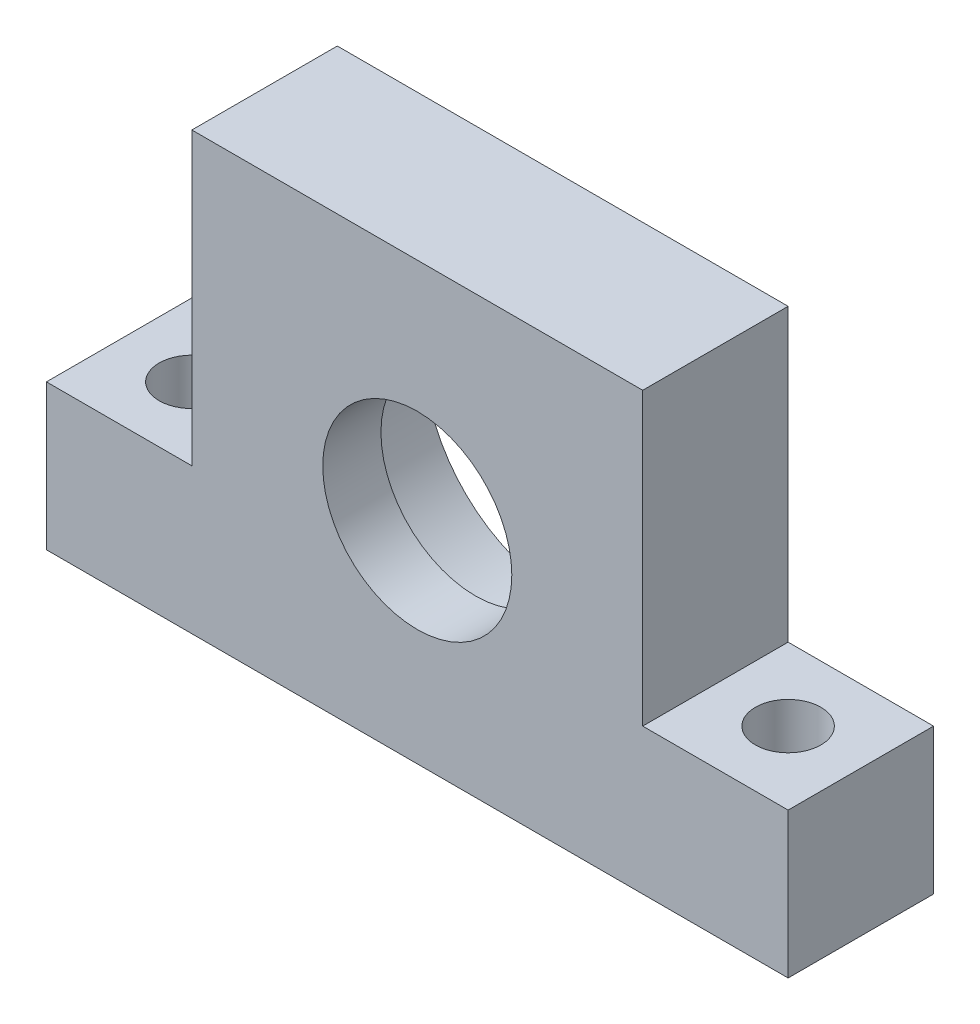
ISO-10303-21;
HEADER;
FILE_DESCRIPTION(('STEP AP214'),'2;1');
FILE_NAME('part.step','',(''),(''),'','','');
FILE_SCHEMA(('AUTOMOTIVE_DESIGN { 1 0 10303 214 1 1 1 1 }'));
ENDSEC;
DATA;
#1=APPLICATION_CONTEXT('core data for automotive mechanical design processes');
#2=APPLICATION_PROTOCOL_DEFINITION('international standard','automotive_design',2000,#1);
#3=PRODUCT_CONTEXT('',#1,'mechanical');
#4=PRODUCT('Part','Part','',(#3));
#5=PRODUCT_RELATED_PRODUCT_CATEGORY('part','',(#4));
#6=PRODUCT_DEFINITION_FORMATION('','',#4);
#7=PRODUCT_DEFINITION_CONTEXT('part definition',#1,'design');
#8=PRODUCT_DEFINITION('design','',#6,#7);
#9=PRODUCT_DEFINITION_SHAPE('','',#8);
#10=(LENGTH_UNIT() NAMED_UNIT(*) SI_UNIT(.MILLI.,.METRE.));
#11=(NAMED_UNIT(*) PLANE_ANGLE_UNIT() SI_UNIT($,.RADIAN.));
#12=(NAMED_UNIT(*) SI_UNIT($,.STERADIAN.) SOLID_ANGLE_UNIT());
#13=UNCERTAINTY_MEASURE_WITH_UNIT(LENGTH_MEASURE(1.E-05),#10,'distance_accuracy_value','');
#14=(GEOMETRIC_REPRESENTATION_CONTEXT(3) GLOBAL_UNCERTAINTY_ASSIGNED_CONTEXT((#13)) GLOBAL_UNIT_ASSIGNED_CONTEXT((#10,
#11,#12)) REPRESENTATION_CONTEXT('',''));
#15=CARTESIAN_POINT('',(0.,0.,0.));
#16=DIRECTION('',(0.,0.,1.));
#17=DIRECTION('',(1.,0.,0.));
#18=AXIS2_PLACEMENT_3D('',#15,#16,#17);
#19=CARTESIAN_POINT('',(-17.4535880149813,1.30341573033708,10.));
#20=DIRECTION('',(0.,0.,-1.));
#21=DIRECTION('',(-1.,0.,0.));
#22=AXIS2_PLACEMENT_3D('',#19,#20,#21);
#23=CYLINDRICAL_SURFACE('',#22,6.5);
#24=CARTESIAN_POINT('',(-17.4535880149813,1.30341573033708,10.));
#25=DIRECTION('',(0.,0.,-1.));
#26=DIRECTION('',(-1.,0.,0.));
#27=AXIS2_PLACEMENT_3D('',#24,#25,#26);
#28=CIRCLE('',#27,6.5);
#29=CARTESIAN_POINT('',(-23.9535880149813,1.30341573033708,10.));
#30=VERTEX_POINT('',#29);
#31=EDGE_CURVE('E151',#30,#30,#28,.T.);
#32=ORIENTED_EDGE('',*,*,#31,.F.);
#33=EDGE_LOOP('',(#32));
#34=FACE_BOUND('',#33,.T.);
#35=CARTESIAN_POINT('',(-17.4535880149813,1.30341573033708,6.));
#36=DIRECTION('',(0.,0.,-1.));
#37=DIRECTION('',(-1.,0.,0.));
#38=AXIS2_PLACEMENT_3D('',#35,#36,#37);
#39=CIRCLE('',#38,6.5);
#40=CARTESIAN_POINT('',(-23.9535880149813,1.30341573033708,6.));
#41=VERTEX_POINT('',#40);
#42=EDGE_CURVE('E46',#41,#41,#39,.F.);
#43=ORIENTED_EDGE('',*,*,#42,.F.);
#44=EDGE_LOOP('',(#43));
#45=FACE_BOUND('',#44,.T.);
#46=ADVANCED_FACE('F42',(#34,#45),#23,.F.);
#47=CARTESIAN_POINT('',(-42.9535880149812,-3.19658426966292,10.));
#48=DIRECTION('',(1.,0.,0.));
#49=DIRECTION('',(0.,0.,-1.));
#50=AXIS2_PLACEMENT_3D('',#47,#48,#49);
#51=PLANE('',#50);
#52=DIRECTION('',(0.,-1.,0.));
#53=VECTOR('',#52,1.);
#54=CARTESIAN_POINT('',(-42.9535880149812,-3.19658426966292,0.));
#55=LINE('',#54,#53);
#56=CARTESIAN_POINT('',(-42.9535880149812,-3.19658426966292,0.));
#57=VERTEX_POINT('',#56);
#58=CARTESIAN_POINT('',(-42.9535880149812,-13.1965842696629,0.));
#59=VERTEX_POINT('',#58);
#60=EDGE_CURVE('E146',#57,#59,#55,.T.);
#61=ORIENTED_EDGE('',*,*,#60,.T.);
#62=DIRECTION('',(0.,0.,-1.));
#63=VECTOR('',#62,1.);
#64=CARTESIAN_POINT('',(-42.9535880149812,-13.1965842696629,10.));
#65=LINE('',#64,#63);
#66=CARTESIAN_POINT('',(-42.9535880149812,-13.1965842696629,10.));
#67=VERTEX_POINT('',#66);
#68=EDGE_CURVE('E11',#67,#59,#65,.T.);
#69=ORIENTED_EDGE('',*,*,#68,.F.);
#70=DIRECTION('',(0.,-1.,0.));
#71=VECTOR('',#70,1.);
#72=CARTESIAN_POINT('',(-42.9535880149812,-3.19658426966292,10.));
#73=LINE('',#72,#71);
#74=CARTESIAN_POINT('',(-42.9535880149812,-3.19658426966292,10.));
#75=VERTEX_POINT('',#74);
#76=EDGE_CURVE('E169',#75,#67,#73,.T.);
#77=ORIENTED_EDGE('',*,*,#76,.F.);
#78=DIRECTION('',(0.,0.,-1.));
#79=VECTOR('',#78,1.);
#80=CARTESIAN_POINT('',(-42.9535880149812,-3.19658426966292,10.));
#81=LINE('',#80,#79);
#82=EDGE_CURVE('E142',#75,#57,#81,.T.);
#83=ORIENTED_EDGE('',*,*,#82,.T.);
#84=EDGE_LOOP('',(#61,#69,#77,#83));
#85=FACE_BOUND('',#84,.T.);
#86=ADVANCED_FACE('F44',(#85),#51,.F.);
#87=CARTESIAN_POINT('',(-42.9535880149812,-13.1965842696629,10.));
#88=DIRECTION('',(0.,1.,0.));
#89=DIRECTION('',(0.,0.,1.));
#90=AXIS2_PLACEMENT_3D('',#87,#88,#89);
#91=PLANE('',#90);
#92=CARTESIAN_POINT('',(3.04641198501875,-13.1965842696629,5.));
#93=DIRECTION('',(0.,1.,0.));
#94=DIRECTION('',(0.,0.,1.));
#95=AXIS2_PLACEMENT_3D('',#92,#93,#94);
#96=CIRCLE('',#95,2.25);
#97=CARTESIAN_POINT('',(3.04641198501875,-13.1965842696629,7.25));
#98=VERTEX_POINT('',#97);
#99=EDGE_CURVE('E224',#98,#98,#96,.T.);
#100=ORIENTED_EDGE('',*,*,#99,.T.);
#101=EDGE_LOOP('',(#100));
#102=FACE_BOUND('',#101,.T.);
#103=CARTESIAN_POINT('',(-37.9535880149813,-13.1965842696629,5.));
#104=DIRECTION('',(0.,1.,0.));
#105=DIRECTION('',(0.,0.,1.));
#106=AXIS2_PLACEMENT_3D('',#103,#104,#105);
#107=CIRCLE('',#106,2.25);
#108=CARTESIAN_POINT('',(-37.9535880149813,-13.1965842696629,7.25));
#109=VERTEX_POINT('',#108);
#110=EDGE_CURVE('E231',#109,#109,#107,.T.);
#111=ORIENTED_EDGE('',*,*,#110,.T.);
#112=EDGE_LOOP('',(#111));
#113=FACE_BOUND('',#112,.T.);
#114=DIRECTION('',(1.,0.,0.));
#115=VECTOR('',#114,1.);
#116=CARTESIAN_POINT('',(-42.9535880149812,-13.1965842696629,0.));
#117=LINE('',#116,#115);
#118=CARTESIAN_POINT('',(8.04641198501874,-13.1965842696629,0.));
#119=VERTEX_POINT('',#118);
#120=EDGE_CURVE('E150',#59,#119,#117,.T.);
#121=ORIENTED_EDGE('',*,*,#120,.T.);
#122=DIRECTION('',(0.,0.,-1.));
#123=VECTOR('',#122,1.);
#124=CARTESIAN_POINT('',(8.04641198501874,-13.1965842696629,10.));
#125=LINE('',#124,#123);
#126=CARTESIAN_POINT('',(8.04641198501874,-13.1965842696629,10.));
#127=VERTEX_POINT('',#126);
#128=EDGE_CURVE('E53',#127,#119,#125,.T.);
#129=ORIENTED_EDGE('',*,*,#128,.F.);
#130=DIRECTION('',(1.,0.,0.));
#131=VECTOR('',#130,1.);
#132=CARTESIAN_POINT('',(-42.9535880149812,-13.1965842696629,10.));
#133=LINE('',#132,#131);
#134=EDGE_CURVE('E104',#67,#127,#133,.T.);
#135=ORIENTED_EDGE('',*,*,#134,.F.);
#136=ORIENTED_EDGE('',*,*,#68,.T.);
#137=EDGE_LOOP('',(#121,#129,#135,#136));
#138=FACE_BOUND('',#137,.T.);
#139=ADVANCED_FACE('F255',(#102,#113,#138),#91,.F.);
#140=CARTESIAN_POINT('',(8.04641198501874,-13.1965842696629,10.));
#141=DIRECTION('',(-1.,0.,0.));
#142=DIRECTION('',(0.,0.,1.));
#143=AXIS2_PLACEMENT_3D('',#140,#141,#142);
#144=PLANE('',#143);
#145=DIRECTION('',(0.,1.,0.));
#146=VECTOR('',#145,1.);
#147=CARTESIAN_POINT('',(8.04641198501874,-13.1965842696629,0.));
#148=LINE('',#147,#146);
#149=CARTESIAN_POINT('',(8.04641198501874,-3.19658426966291,0.));
#150=VERTEX_POINT('',#149);
#151=EDGE_CURVE('E154',#119,#150,#148,.T.);
#152=ORIENTED_EDGE('',*,*,#151,.T.);
#153=DIRECTION('',(0.,0.,-1.));
#154=VECTOR('',#153,1.);
#155=CARTESIAN_POINT('',(8.04641198501874,-3.19658426966291,10.));
#156=LINE('',#155,#154);
#157=CARTESIAN_POINT('',(8.04641198501874,-3.19658426966291,10.));
#158=VERTEX_POINT('',#157);
#159=EDGE_CURVE('E180',#158,#150,#156,.T.);
#160=ORIENTED_EDGE('',*,*,#159,.F.);
#161=DIRECTION('',(0.,1.,0.));
#162=VECTOR('',#161,1.);
#163=CARTESIAN_POINT('',(8.04641198501874,-13.1965842696629,10.));
#164=LINE('',#163,#162);
#165=EDGE_CURVE('E192',#127,#158,#164,.T.);
#166=ORIENTED_EDGE('',*,*,#165,.F.);
#167=ORIENTED_EDGE('',*,*,#128,.T.);
#168=EDGE_LOOP('',(#152,#160,#166,#167));
#169=FACE_BOUND('',#168,.T.);
#170=ADVANCED_FACE('F190',(#169),#144,.F.);
#171=CARTESIAN_POINT('',(8.04641198501874,-3.19658426966291,10.));
#172=DIRECTION('',(0.,-1.,0.));
#173=DIRECTION('',(1.,0.,0.));
#174=AXIS2_PLACEMENT_3D('',#171,#172,#173);
#175=PLANE('',#174);
#176=CARTESIAN_POINT('',(3.04641198501874,-3.19658426966291,5.));
#177=DIRECTION('',(0.,1.,0.));
#178=DIRECTION('',(-1.,0.,0.));
#179=AXIS2_PLACEMENT_3D('',#176,#177,#178);
#180=CIRCLE('',#179,2.25);
#181=CARTESIAN_POINT('',(0.796411985018745,-3.19658426966291,5.));
#182=VERTEX_POINT('',#181);
#183=EDGE_CURVE('E235',#182,#182,#180,.T.);
#184=ORIENTED_EDGE('',*,*,#183,.F.);
#185=EDGE_LOOP('',(#184));
#186=FACE_BOUND('',#185,.T.);
#187=DIRECTION('',(-1.,0.,0.));
#188=VECTOR('',#187,1.);
#189=CARTESIAN_POINT('',(8.04641198501874,-3.19658426966291,0.));
#190=LINE('',#189,#188);
#191=CARTESIAN_POINT('',(-1.95358801498126,-3.19658426966292,0.));
#192=VERTEX_POINT('',#191);
#193=EDGE_CURVE('E157',#150,#192,#190,.T.);
#194=ORIENTED_EDGE('',*,*,#193,.T.);
#195=DIRECTION('',(0.,0.,-1.));
#196=VECTOR('',#195,1.);
#197=CARTESIAN_POINT('',(-1.95358801498126,-3.19658426966292,10.));
#198=LINE('',#197,#196);
#199=CARTESIAN_POINT('',(-1.95358801498126,-3.19658426966292,10.));
#200=VERTEX_POINT('',#199);
#201=EDGE_CURVE('E176',#200,#192,#198,.T.);
#202=ORIENTED_EDGE('',*,*,#201,.F.);
#203=DIRECTION('',(-1.,0.,0.));
#204=VECTOR('',#203,1.);
#205=CARTESIAN_POINT('',(8.04641198501874,-3.19658426966291,10.));
#206=LINE('',#205,#204);
#207=EDGE_CURVE('E205',#158,#200,#206,.T.);
#208=ORIENTED_EDGE('',*,*,#207,.F.);
#209=ORIENTED_EDGE('',*,*,#159,.T.);
#210=EDGE_LOOP('',(#194,#202,#208,#209));
#211=FACE_BOUND('',#210,.T.);
#212=ADVANCED_FACE('F200',(#186,#211),#175,.F.);
#213=CARTESIAN_POINT('',(-1.95358801498126,-3.19658426966292,10.));
#214=DIRECTION('',(-1.,0.,0.));
#215=DIRECTION('',(0.,0.,1.));
#216=AXIS2_PLACEMENT_3D('',#213,#214,#215);
#217=PLANE('',#216);
#218=DIRECTION('',(0.,1.,0.));
#219=VECTOR('',#218,1.);
#220=CARTESIAN_POINT('',(-1.95358801498126,-3.19658426966292,0.));
#221=LINE('',#220,#219);
#222=CARTESIAN_POINT('',(-1.95358801498126,16.8034157303371,0.));
#223=VERTEX_POINT('',#222);
#224=EDGE_CURVE('E160',#192,#223,#221,.T.);
#225=ORIENTED_EDGE('',*,*,#224,.T.);
#226=DIRECTION('',(0.,0.,-1.));
#227=VECTOR('',#226,1.);
#228=CARTESIAN_POINT('',(-1.95358801498126,16.8034157303371,10.));
#229=LINE('',#228,#227);
#230=CARTESIAN_POINT('',(-1.95358801498126,16.8034157303371,10.));
#231=VERTEX_POINT('',#230);
#232=EDGE_CURVE('E134',#231,#223,#229,.T.);
#233=ORIENTED_EDGE('',*,*,#232,.F.);
#234=DIRECTION('',(0.,1.,0.));
#235=VECTOR('',#234,1.);
#236=CARTESIAN_POINT('',(-1.95358801498126,-3.19658426966292,10.));
#237=LINE('',#236,#235);
#238=EDGE_CURVE('E123',#200,#231,#237,.T.);
#239=ORIENTED_EDGE('',*,*,#238,.F.);
#240=ORIENTED_EDGE('',*,*,#201,.T.);
#241=EDGE_LOOP('',(#225,#233,#239,#240));
#242=FACE_BOUND('',#241,.T.);
#243=ADVANCED_FACE('F203',(#242),#217,.F.);
#244=CARTESIAN_POINT('',(-1.95358801498126,16.8034157303371,10.));
#245=DIRECTION('',(0.,-1.,0.));
#246=DIRECTION('',(0.,0.,-1.));
#247=AXIS2_PLACEMENT_3D('',#244,#245,#246);
#248=PLANE('',#247);
#249=DIRECTION('',(-1.,0.,0.));
#250=VECTOR('',#249,1.);
#251=CARTESIAN_POINT('',(-1.95358801498126,16.8034157303371,0.));
#252=LINE('',#251,#250);
#253=CARTESIAN_POINT('',(-32.9535880149813,16.8034157303371,0.));
#254=VERTEX_POINT('',#253);
#255=EDGE_CURVE('E132',#223,#254,#252,.T.);
#256=ORIENTED_EDGE('',*,*,#255,.T.);
#257=DIRECTION('',(0.,0.,-1.));
#258=VECTOR('',#257,1.);
#259=CARTESIAN_POINT('',(-32.9535880149813,16.8034157303371,10.));
#260=LINE('',#259,#258);
#261=CARTESIAN_POINT('',(-32.9535880149813,16.8034157303371,10.));
#262=VERTEX_POINT('',#261);
#263=EDGE_CURVE('E129',#262,#254,#260,.T.);
#264=ORIENTED_EDGE('',*,*,#263,.F.);
#265=DIRECTION('',(-1.,0.,0.));
#266=VECTOR('',#265,1.);
#267=CARTESIAN_POINT('',(-1.95358801498126,16.8034157303371,10.));
#268=LINE('',#267,#266);
#269=EDGE_CURVE('E117',#231,#262,#268,.T.);
#270=ORIENTED_EDGE('',*,*,#269,.F.);
#271=ORIENTED_EDGE('',*,*,#232,.T.);
#272=EDGE_LOOP('',(#256,#264,#270,#271));
#273=FACE_BOUND('',#272,.T.);
#274=ADVANCED_FACE('F130',(#273),#248,.F.);
#275=CARTESIAN_POINT('',(-32.9535880149813,16.8034157303371,10.));
#276=DIRECTION('',(1.,0.,0.));
#277=DIRECTION('',(0.,0.,-1.));
#278=AXIS2_PLACEMENT_3D('',#275,#276,#277);
#279=PLANE('',#278);
#280=DIRECTION('',(0.,-1.,0.));
#281=VECTOR('',#280,1.);
#282=CARTESIAN_POINT('',(-32.9535880149813,16.8034157303371,0.));
#283=LINE('',#282,#281);
#284=CARTESIAN_POINT('',(-32.9535880149813,-3.19658426966292,0.));
#285=VERTEX_POINT('',#284);
#286=EDGE_CURVE('E90',#254,#285,#283,.T.);
#287=ORIENTED_EDGE('',*,*,#286,.T.);
#288=DIRECTION('',(0.,0.,-1.));
#289=VECTOR('',#288,1.);
#290=CARTESIAN_POINT('',(-32.9535880149813,-3.19658426966292,10.));
#291=LINE('',#290,#289);
#292=CARTESIAN_POINT('',(-32.9535880149813,-3.19658426966292,10.));
#293=VERTEX_POINT('',#292);
#294=EDGE_CURVE('E135',#293,#285,#291,.T.);
#295=ORIENTED_EDGE('',*,*,#294,.F.);
#296=DIRECTION('',(0.,-1.,0.));
#297=VECTOR('',#296,1.);
#298=CARTESIAN_POINT('',(-32.9535880149813,16.8034157303371,10.));
#299=LINE('',#298,#297);
#300=EDGE_CURVE('E121',#262,#293,#299,.T.);
#301=ORIENTED_EDGE('',*,*,#300,.F.);
#302=ORIENTED_EDGE('',*,*,#263,.T.);
#303=EDGE_LOOP('',(#287,#295,#301,#302));
#304=FACE_BOUND('',#303,.T.);
#305=ADVANCED_FACE('F137',(#304),#279,.F.);
#306=CARTESIAN_POINT('',(-32.9535880149813,-3.19658426966292,10.));
#307=DIRECTION('',(0.,-1.,0.));
#308=DIRECTION('',(0.,0.,-1.));
#309=AXIS2_PLACEMENT_3D('',#306,#307,#308);
#310=PLANE('',#309);
#311=CARTESIAN_POINT('',(-37.9535880149813,-3.19658426966292,5.));
#312=DIRECTION('',(0.,1.,0.));
#313=DIRECTION('',(-1.,0.,0.));
#314=AXIS2_PLACEMENT_3D('',#311,#312,#313);
#315=CIRCLE('',#314,2.25);
#316=CARTESIAN_POINT('',(-40.2035880149813,-3.19658426966292,5.));
#317=VERTEX_POINT('',#316);
#318=EDGE_CURVE('E236',#317,#317,#315,.T.);
#319=ORIENTED_EDGE('',*,*,#318,.F.);
#320=EDGE_LOOP('',(#319));
#321=FACE_BOUND('',#320,.T.);
#322=DIRECTION('',(-1.,0.,0.));
#323=VECTOR('',#322,1.);
#324=CARTESIAN_POINT('',(-32.9535880149813,-3.19658426966292,0.));
#325=LINE('',#324,#323);
#326=EDGE_CURVE('E96',#285,#57,#325,.T.);
#327=ORIENTED_EDGE('',*,*,#326,.T.);
#328=ORIENTED_EDGE('',*,*,#82,.F.);
#329=DIRECTION('',(-1.,0.,0.));
#330=VECTOR('',#329,1.);
#331=CARTESIAN_POINT('',(-32.9535880149813,-3.19658426966292,10.));
#332=LINE('',#331,#330);
#333=EDGE_CURVE('E61',#293,#75,#332,.T.);
#334=ORIENTED_EDGE('',*,*,#333,.F.);
#335=ORIENTED_EDGE('',*,*,#294,.T.);
#336=EDGE_LOOP('',(#327,#328,#334,#335));
#337=FACE_BOUND('',#336,.T.);
#338=ADVANCED_FACE('F272',(#321,#337),#310,.F.);
#339=CARTESIAN_POINT('',(0.,0.,10.));
#340=DIRECTION('',(0.,0.,1.));
#341=DIRECTION('',(1.,0.,0.));
#342=AXIS2_PLACEMENT_3D('',#339,#340,#341);
#343=PLANE('',#342);
#344=ORIENTED_EDGE('',*,*,#31,.T.);
#345=EDGE_LOOP('',(#344));
#346=FACE_BOUND('',#345,.T.);
#347=ORIENTED_EDGE('',*,*,#76,.T.);
#348=ORIENTED_EDGE('',*,*,#134,.T.);
#349=ORIENTED_EDGE('',*,*,#165,.T.);
#350=ORIENTED_EDGE('',*,*,#207,.T.);
#351=ORIENTED_EDGE('',*,*,#238,.T.);
#352=ORIENTED_EDGE('',*,*,#269,.T.);
#353=ORIENTED_EDGE('',*,*,#300,.T.);
#354=ORIENTED_EDGE('',*,*,#333,.T.);
#355=EDGE_LOOP('',(#347,#348,#349,#350,#351,#352,#353,#354));
#356=FACE_BOUND('',#355,.T.);
#357=ADVANCED_FACE('F119',(#346,#356),#343,.T.);
#358=CARTESIAN_POINT('',(0.,0.,0.));
#359=DIRECTION('',(0.,0.,1.));
#360=DIRECTION('',(1.,0.,0.));
#361=AXIS2_PLACEMENT_3D('',#358,#359,#360);
#362=PLANE('',#361);
#363=CARTESIAN_POINT('',(-17.4535880149813,1.30341573033708,0.));
#364=DIRECTION('',(0.,0.,-1.));
#365=DIRECTION('',(-1.,0.,0.));
#366=AXIS2_PLACEMENT_3D('',#363,#364,#365);
#367=CIRCLE('',#366,9.5);
#368=CARTESIAN_POINT('',(-26.9535880149813,1.30341573033708,0.));
#369=VERTEX_POINT('',#368);
#370=EDGE_CURVE('E219',#369,#369,#367,.T.);
#371=ORIENTED_EDGE('',*,*,#370,.F.);
#372=EDGE_LOOP('',(#371));
#373=FACE_BOUND('',#372,.T.);
#374=ORIENTED_EDGE('',*,*,#60,.F.);
#375=ORIENTED_EDGE('',*,*,#326,.F.);
#376=ORIENTED_EDGE('',*,*,#286,.F.);
#377=ORIENTED_EDGE('',*,*,#255,.F.);
#378=ORIENTED_EDGE('',*,*,#224,.F.);
#379=ORIENTED_EDGE('',*,*,#193,.F.);
#380=ORIENTED_EDGE('',*,*,#151,.F.);
#381=ORIENTED_EDGE('',*,*,#120,.F.);
#382=EDGE_LOOP('',(#374,#375,#376,#377,#378,#379,#380,#381));
#383=FACE_BOUND('',#382,.T.);
#384=ADVANCED_FACE('F196',(#373,#383),#362,.F.);
#385=CARTESIAN_POINT('',(-17.4535880149813,1.30341573033708,6.));
#386=DIRECTION('',(0.,0.,-1.));
#387=DIRECTION('',(-1.,0.,0.));
#388=AXIS2_PLACEMENT_3D('',#385,#386,#387);
#389=PLANE('',#388);
#390=CARTESIAN_POINT('',(-17.4535880149813,1.30341573033708,6.));
#391=DIRECTION('',(0.,0.,-1.));
#392=DIRECTION('',(-1.,0.,0.));
#393=AXIS2_PLACEMENT_3D('',#390,#391,#392);
#394=CIRCLE('',#393,9.5);
#395=CARTESIAN_POINT('',(-26.9535880149813,1.30341573033708,6.));
#396=VERTEX_POINT('',#395);
#397=EDGE_CURVE('E223',#396,#396,#394,.T.);
#398=ORIENTED_EDGE('',*,*,#397,.T.);
#399=EDGE_LOOP('',(#398));
#400=FACE_BOUND('',#399,.T.);
#401=ORIENTED_EDGE('',*,*,#42,.T.);
#402=EDGE_LOOP('',(#401));
#403=FACE_BOUND('',#402,.T.);
#404=ADVANCED_FACE('F276',(#400,#403),#389,.T.);
#405=CARTESIAN_POINT('',(-17.4535880149813,1.30341573033708,6.));
#406=DIRECTION('',(0.,0.,-1.));
#407=DIRECTION('',(-1.,0.,0.));
#408=AXIS2_PLACEMENT_3D('',#405,#406,#407);
#409=CYLINDRICAL_SURFACE('',#408,9.5);
#410=ORIENTED_EDGE('',*,*,#397,.F.);
#411=EDGE_LOOP('',(#410));
#412=FACE_BOUND('',#411,.T.);
#413=ORIENTED_EDGE('',*,*,#370,.T.);
#414=EDGE_LOOP('',(#413));
#415=FACE_BOUND('',#414,.T.);
#416=ADVANCED_FACE('F268',(#412,#415),#409,.F.);
#417=CARTESIAN_POINT('',(-37.9535880149813,-18.1965842696629,5.));
#418=DIRECTION('',(0.,1.,0.));
#419=DIRECTION('',(-1.,0.,0.));
#420=AXIS2_PLACEMENT_3D('',#417,#418,#419);
#421=CYLINDRICAL_SURFACE('',#420,2.25);
#422=ORIENTED_EDGE('',*,*,#318,.T.);
#423=EDGE_LOOP('',(#422));
#424=FACE_BOUND('',#423,.T.);
#425=ORIENTED_EDGE('',*,*,#110,.F.);
#426=EDGE_LOOP('',(#425));
#427=FACE_BOUND('',#426,.T.);
#428=ADVANCED_FACE('F317',(#424,#427),#421,.F.);
#429=CARTESIAN_POINT('',(3.04641198501875,-18.1965842696629,5.));
#430=DIRECTION('',(0.,1.,0.));
#431=DIRECTION('',(-1.,0.,0.));
#432=AXIS2_PLACEMENT_3D('',#429,#430,#431);
#433=CYLINDRICAL_SURFACE('',#432,2.25);
#434=ORIENTED_EDGE('',*,*,#183,.T.);
#435=EDGE_LOOP('',(#434));
#436=FACE_BOUND('',#435,.T.);
#437=ORIENTED_EDGE('',*,*,#99,.F.);
#438=EDGE_LOOP('',(#437));
#439=FACE_BOUND('',#438,.T.);
#440=ADVANCED_FACE('F245',(#436,#439),#433,.F.);
#441=CLOSED_SHELL('',(#46,#86,#139,#170,#212,#243,#274,#305,#338,#357,#384,#404,#416,#428,#440));
#442=MANIFOLD_SOLID_BREP('B2',#441);
#443=ADVANCED_BREP_SHAPE_REPRESENTATION('',(#18,#442),#14);
#444=SHAPE_DEFINITION_REPRESENTATION(#9,#443);
ENDSEC;
END-ISO-10303-21;
